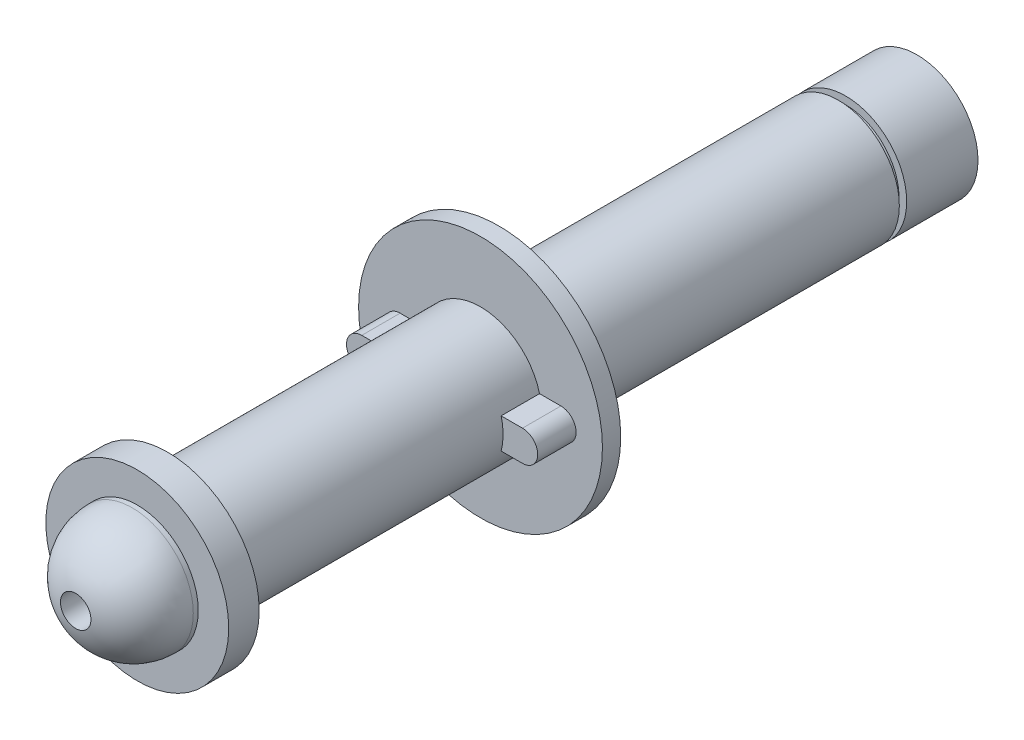
ISO-10303-21;
HEADER;
FILE_DESCRIPTION(('STEP AP214'),'2;1');
FILE_NAME('part.step','',(''),(''),'','','');
FILE_SCHEMA(('AUTOMOTIVE_DESIGN { 1 0 10303 214 1 1 1 1 }'));
ENDSEC;
DATA;
#1=APPLICATION_CONTEXT('core data for automotive mechanical design processes');
#2=APPLICATION_PROTOCOL_DEFINITION('international standard','automotive_design',2000,#1);
#3=PRODUCT_CONTEXT('',#1,'mechanical');
#4=PRODUCT('Part','Part','',(#3));
#5=PRODUCT_RELATED_PRODUCT_CATEGORY('part','',(#4));
#6=PRODUCT_DEFINITION_FORMATION('','',#4);
#7=PRODUCT_DEFINITION_CONTEXT('part definition',#1,'design');
#8=PRODUCT_DEFINITION('design','',#6,#7);
#9=PRODUCT_DEFINITION_SHAPE('','',#8);
#10=(LENGTH_UNIT() NAMED_UNIT(*) SI_UNIT(.MILLI.,.METRE.));
#11=(NAMED_UNIT(*) PLANE_ANGLE_UNIT() SI_UNIT($,.RADIAN.));
#12=(NAMED_UNIT(*) SI_UNIT($,.STERADIAN.) SOLID_ANGLE_UNIT());
#13=UNCERTAINTY_MEASURE_WITH_UNIT(LENGTH_MEASURE(1.E-05),#10,'distance_accuracy_value','');
#14=(GEOMETRIC_REPRESENTATION_CONTEXT(3) GLOBAL_UNCERTAINTY_ASSIGNED_CONTEXT((#13)) GLOBAL_UNIT_ASSIGNED_CONTEXT((#10,
#11,#12)) REPRESENTATION_CONTEXT('',''));
#15=CARTESIAN_POINT('',(0.,0.,0.));
#16=DIRECTION('',(0.,0.,1.));
#17=DIRECTION('',(1.,0.,0.));
#18=AXIS2_PLACEMENT_3D('',#15,#16,#17);
#19=CARTESIAN_POINT('',(0.,0.,147.236078351609));
#20=DIRECTION('',(0.,0.,-1.));
#21=DIRECTION('',(-1.,0.,0.));
#22=AXIS2_PLACEMENT_3D('',#19,#20,#21);
#23=CYLINDRICAL_SURFACE('',#22,5.);
#24=DIRECTION('',(0.,0.,-1.));
#25=VECTOR('',#24,1.);
#26=CARTESIAN_POINT('',(4.84122918275927,1.25,144.686078351609));
#27=LINE('',#26,#25);
#28=CARTESIAN_POINT('',(4.84122918275927,1.25,144.686078351609));
#29=VERTEX_POINT('',#28);
#30=CARTESIAN_POINT('',(4.84122918275927,1.25,141.536078351609));
#31=VERTEX_POINT('',#30);
#32=EDGE_CURVE('E129',#29,#31,#27,.T.);
#33=ORIENTED_EDGE('',*,*,#32,.T.);
#34=CARTESIAN_POINT('',(0.,0.,141.536078351609));
#35=DIRECTION('',(0.,0.,1.));
#36=DIRECTION('',(1.,0.,0.));
#37=AXIS2_PLACEMENT_3D('',#34,#35,#36);
#38=CIRCLE('',#37,5.);
#39=CARTESIAN_POINT('',(-4.84122918275927,1.25,141.536078351609));
#40=VERTEX_POINT('',#39);
#41=EDGE_CURVE('E111',#31,#40,#38,.T.);
#42=ORIENTED_EDGE('',*,*,#41,.T.);
#43=DIRECTION('',(0.,0.,-1.));
#44=VECTOR('',#43,1.);
#45=CARTESIAN_POINT('',(-4.84122918275927,1.25,144.686078351609));
#46=LINE('',#45,#44);
#47=CARTESIAN_POINT('',(-4.84122918275927,1.25,144.686078351609));
#48=VERTEX_POINT('',#47);
#49=EDGE_CURVE('E158',#48,#40,#46,.T.);
#50=ORIENTED_EDGE('',*,*,#49,.F.);
#51=CARTESIAN_POINT('',(0.,0.,144.686078351609));
#52=DIRECTION('',(0.,0.,-1.));
#53=DIRECTION('',(-1.,0.,0.));
#54=AXIS2_PLACEMENT_3D('',#51,#52,#53);
#55=CIRCLE('',#54,5.);
#56=CARTESIAN_POINT('',(-4.84122918275927,-1.25,144.686078351609));
#57=VERTEX_POINT('',#56);
#58=EDGE_CURVE('E143',#57,#48,#55,.T.);
#59=ORIENTED_EDGE('',*,*,#58,.F.);
#60=DIRECTION('',(0.,0.,-1.));
#61=VECTOR('',#60,1.);
#62=CARTESIAN_POINT('',(-4.84122918275927,-1.25,144.686078351609));
#63=LINE('',#62,#61);
#64=CARTESIAN_POINT('',(-4.84122918275927,-1.25,141.536078351609));
#65=VERTEX_POINT('',#64);
#66=EDGE_CURVE('E161',#57,#65,#63,.T.);
#67=ORIENTED_EDGE('',*,*,#66,.T.);
#68=CARTESIAN_POINT('',(4.84122918275927,-1.25,141.536078351609));
#69=VERTEX_POINT('',#68);
#70=EDGE_CURVE('E231',#65,#69,#38,.T.);
#71=ORIENTED_EDGE('',*,*,#70,.T.);
#72=DIRECTION('',(0.,0.,-1.));
#73=VECTOR('',#72,1.);
#74=CARTESIAN_POINT('',(4.84122918275927,-1.25,144.686078351609));
#75=LINE('',#74,#73);
#76=CARTESIAN_POINT('',(4.84122918275927,-1.25,144.686078351609));
#77=VERTEX_POINT('',#76);
#78=EDGE_CURVE('E55',#77,#69,#75,.T.);
#79=ORIENTED_EDGE('',*,*,#78,.F.);
#80=CARTESIAN_POINT('',(0.,0.,144.686078351609));
#81=DIRECTION('',(0.,0.,-1.));
#82=DIRECTION('',(1.,0.,0.));
#83=AXIS2_PLACEMENT_3D('',#80,#81,#82);
#84=CIRCLE('',#83,5.);
#85=EDGE_CURVE('E60',#29,#77,#84,.T.);
#86=ORIENTED_EDGE('',*,*,#85,.F.);
#87=EDGE_LOOP('',(#33,#42,#50,#59,#67,#71,#79,#86));
#88=FACE_BOUND('',#87,.T.);
#89=CARTESIAN_POINT('',(0.,0.,167.186078351609));
#90=DIRECTION('',(0.,0.,1.));
#91=DIRECTION('',(1.,0.,0.));
#92=AXIS2_PLACEMENT_3D('',#89,#90,#91);
#93=CIRCLE('',#92,5.);
#94=CARTESIAN_POINT('',(5.,0.,167.186078351609));
#95=VERTEX_POINT('',#94);
#96=EDGE_CURVE('E48',#95,#95,#93,.T.);
#97=ORIENTED_EDGE('',*,*,#96,.F.);
#98=EDGE_LOOP('',(#97));
#99=FACE_BOUND('',#98,.T.);
#100=ADVANCED_FACE('F39',(#88,#99),#23,.T.);
#101=CARTESIAN_POINT('',(0.,0.,139.786078351609));
#102=DIRECTION('',(0.,0.,1.));
#103=DIRECTION('',(1.,0.,0.));
#104=AXIS2_PLACEMENT_3D('',#101,#102,#103);
#105=CIRCLE('',#104,5.);
#106=CARTESIAN_POINT('',(5.,0.,139.786078351609));
#107=VERTEX_POINT('',#106);
#108=EDGE_CURVE('E171',#107,#107,#105,.T.);
#109=ORIENTED_EDGE('',*,*,#108,.T.);
#110=EDGE_LOOP('',(#109));
#111=FACE_BOUND('',#110,.T.);
#112=CARTESIAN_POINT('',(0.,0.,140.036078351609));
#113=DIRECTION('',(0.,0.,1.));
#114=DIRECTION('',(1.,0.,0.));
#115=AXIS2_PLACEMENT_3D('',#112,#113,#114);
#116=CIRCLE('',#115,5.);
#117=CARTESIAN_POINT('',(5.,0.,140.036078351609));
#118=VERTEX_POINT('',#117);
#119=EDGE_CURVE('E208',#118,#118,#116,.T.);
#120=ORIENTED_EDGE('',*,*,#119,.F.);
#121=EDGE_LOOP('',(#120));
#122=FACE_BOUND('',#121,.T.);
#123=ADVANCED_FACE('F278',(#111,#122),#23,.T.);
#124=CARTESIAN_POINT('',(0.,0.,147.236078351609));
#125=DIRECTION('',(0.,0.,-1.));
#126=DIRECTION('',(-1.,0.,0.));
#127=AXIS2_PLACEMENT_3D('',#124,#125,#126);
#128=CYLINDRICAL_SURFACE('',#127,1.25);
#129=CARTESIAN_POINT('',(0.,0.,105.736078351609));
#130=DIRECTION('',(0.,0.,1.));
#131=DIRECTION('',(1.,0.,0.));
#132=AXIS2_PLACEMENT_3D('',#129,#130,#131);
#133=CIRCLE('',#132,1.25);
#134=CARTESIAN_POINT('',(1.25,0.,105.736078351609));
#135=VERTEX_POINT('',#134);
#136=EDGE_CURVE('E189',#135,#135,#133,.T.);
#137=ORIENTED_EDGE('',*,*,#136,.F.);
#138=EDGE_LOOP('',(#137));
#139=FACE_BOUND('',#138,.T.);
#140=CARTESIAN_POINT('',(0.,0.,140.036078351609));
#141=DIRECTION('',(0.,0.,1.));
#142=DIRECTION('',(1.,0.,0.));
#143=AXIS2_PLACEMENT_3D('',#140,#141,#142);
#144=CIRCLE('',#143,1.25);
#145=CARTESIAN_POINT('',(1.25,0.,140.036078351609));
#146=VERTEX_POINT('',#145);
#147=EDGE_CURVE('E198',#146,#146,#144,.T.);
#148=ORIENTED_EDGE('',*,*,#147,.T.);
#149=EDGE_LOOP('',(#148));
#150=FACE_BOUND('',#149,.T.);
#151=ADVANCED_FACE('F282',(#139,#150),#128,.F.);
#152=CARTESIAN_POINT('',(0.,0.,112.186078351609));
#153=DIRECTION('',(0.,0.,1.));
#154=DIRECTION('',(1.,0.,0.));
#155=AXIS2_PLACEMENT_3D('',#152,#153,#154);
#156=CIRCLE('',#155,5.);
#157=CARTESIAN_POINT('',(5.,0.,112.186078351609));
#158=VERTEX_POINT('',#157);
#159=EDGE_CURVE('E183',#158,#158,#156,.T.);
#160=ORIENTED_EDGE('',*,*,#159,.T.);
#161=EDGE_LOOP('',(#160));
#162=FACE_BOUND('',#161,.T.);
#163=CARTESIAN_POINT('',(0.,0.,139.186078351609));
#164=DIRECTION('',(0.,0.,1.));
#165=DIRECTION('',(1.,0.,0.));
#166=AXIS2_PLACEMENT_3D('',#163,#164,#165);
#167=CIRCLE('',#166,5.);
#168=CARTESIAN_POINT('',(5.,0.,139.186078351609));
#169=VERTEX_POINT('',#168);
#170=EDGE_CURVE('E174',#169,#169,#167,.T.);
#171=ORIENTED_EDGE('',*,*,#170,.F.);
#172=EDGE_LOOP('',(#171));
#173=FACE_BOUND('',#172,.T.);
#174=ADVANCED_FACE('F284',(#162,#173),#23,.T.);
#175=CARTESIAN_POINT('',(0.,0.,105.736078351609));
#176=DIRECTION('',(0.,0.,1.));
#177=DIRECTION('',(1.,0.,0.));
#178=AXIS2_PLACEMENT_3D('',#175,#176,#177);
#179=CIRCLE('',#178,5.);
#180=CARTESIAN_POINT('',(5.,0.,105.736078351609));
#181=VERTEX_POINT('',#180);
#182=EDGE_CURVE('E194',#181,#181,#179,.T.);
#183=ORIENTED_EDGE('',*,*,#182,.T.);
#184=EDGE_LOOP('',(#183));
#185=FACE_BOUND('',#184,.T.);
#186=CARTESIAN_POINT('',(0.,0.,111.586078351609));
#187=DIRECTION('',(0.,0.,1.));
#188=DIRECTION('',(1.,0.,0.));
#189=AXIS2_PLACEMENT_3D('',#186,#187,#188);
#190=CIRCLE('',#189,5.);
#191=CARTESIAN_POINT('',(5.,0.,111.586078351609));
#192=VERTEX_POINT('',#191);
#193=EDGE_CURVE('E186',#192,#192,#190,.T.);
#194=ORIENTED_EDGE('',*,*,#193,.F.);
#195=EDGE_LOOP('',(#194));
#196=FACE_BOUND('',#195,.T.);
#197=ADVANCED_FACE('F269',(#185,#196),#23,.T.);
#198=CARTESIAN_POINT('',(0.,0.,105.736078351609));
#199=DIRECTION('',(0.,0.,1.));
#200=DIRECTION('',(1.,0.,0.));
#201=AXIS2_PLACEMENT_3D('',#198,#199,#200);
#202=PLANE('',#201);
#203=ORIENTED_EDGE('',*,*,#182,.F.);
#204=EDGE_LOOP('',(#203));
#205=FACE_BOUND('',#204,.T.);
#206=ORIENTED_EDGE('',*,*,#136,.T.);
#207=EDGE_LOOP('',(#206));
#208=FACE_BOUND('',#207,.T.);
#209=ADVANCED_FACE('F286',(#205,#208),#202,.F.);
#210=CARTESIAN_POINT('',(0.,0.,111.586078351609));
#211=DIRECTION('',(0.,0.,1.));
#212=DIRECTION('',(1.,0.,0.));
#213=AXIS2_PLACEMENT_3D('',#210,#211,#212);
#214=PLANE('',#213);
#215=CARTESIAN_POINT('',(0.,0.,111.586078351609));
#216=DIRECTION('',(0.,0.,1.));
#217=DIRECTION('',(1.,0.,0.));
#218=AXIS2_PLACEMENT_3D('',#215,#216,#217);
#219=CIRCLE('',#218,4.375);
#220=CARTESIAN_POINT('',(4.375,0.,111.586078351609));
#221=VERTEX_POINT('',#220);
#222=EDGE_CURVE('E180',#221,#221,#219,.T.);
#223=ORIENTED_EDGE('',*,*,#222,.F.);
#224=EDGE_LOOP('',(#223));
#225=FACE_BOUND('',#224,.T.);
#226=ORIENTED_EDGE('',*,*,#193,.T.);
#227=EDGE_LOOP('',(#226));
#228=FACE_BOUND('',#227,.T.);
#229=ADVANCED_FACE('F289',(#225,#228),#214,.T.);
#230=CARTESIAN_POINT('',(0.,0.,112.186078351609));
#231=DIRECTION('',(0.,0.,1.));
#232=DIRECTION('',(1.,0.,0.));
#233=AXIS2_PLACEMENT_3D('',#230,#231,#232);
#234=PLANE('',#233);
#235=CARTESIAN_POINT('',(0.,0.,112.186078351609));
#236=DIRECTION('',(0.,0.,1.));
#237=DIRECTION('',(1.,0.,0.));
#238=AXIS2_PLACEMENT_3D('',#235,#236,#237);
#239=CIRCLE('',#238,4.375);
#240=CARTESIAN_POINT('',(4.375,0.,112.186078351609));
#241=VERTEX_POINT('',#240);
#242=EDGE_CURVE('E177',#241,#241,#239,.T.);
#243=ORIENTED_EDGE('',*,*,#242,.T.);
#244=EDGE_LOOP('',(#243));
#245=FACE_BOUND('',#244,.T.);
#246=ORIENTED_EDGE('',*,*,#159,.F.);
#247=EDGE_LOOP('',(#246));
#248=FACE_BOUND('',#247,.T.);
#249=ADVANCED_FACE('F294',(#245,#248),#234,.F.);
#250=CARTESIAN_POINT('',(0.,0.,111.586078351609));
#251=DIRECTION('',(0.,0.,1.));
#252=DIRECTION('',(1.,0.,0.));
#253=AXIS2_PLACEMENT_3D('',#250,#251,#252);
#254=CYLINDRICAL_SURFACE('',#253,4.375);
#255=ORIENTED_EDGE('',*,*,#222,.T.);
#256=EDGE_LOOP('',(#255));
#257=FACE_BOUND('',#256,.T.);
#258=ORIENTED_EDGE('',*,*,#242,.F.);
#259=EDGE_LOOP('',(#258));
#260=FACE_BOUND('',#259,.T.);
#261=ADVANCED_FACE('F297',(#257,#260),#254,.T.);
#262=CARTESIAN_POINT('',(0.,0.,139.186078351609));
#263=DIRECTION('',(0.,0.,1.));
#264=DIRECTION('',(1.,0.,0.));
#265=AXIS2_PLACEMENT_3D('',#262,#263,#264);
#266=PLANE('',#265);
#267=CARTESIAN_POINT('',(0.,0.,139.186078351609));
#268=DIRECTION('',(0.,0.,1.));
#269=DIRECTION('',(1.,0.,0.));
#270=AXIS2_PLACEMENT_3D('',#267,#268,#269);
#271=CIRCLE('',#270,4.375);
#272=CARTESIAN_POINT('',(4.375,0.,139.186078351609));
#273=VERTEX_POINT('',#272);
#274=EDGE_CURVE('E168',#273,#273,#271,.T.);
#275=ORIENTED_EDGE('',*,*,#274,.F.);
#276=EDGE_LOOP('',(#275));
#277=FACE_BOUND('',#276,.T.);
#278=ORIENTED_EDGE('',*,*,#170,.T.);
#279=EDGE_LOOP('',(#278));
#280=FACE_BOUND('',#279,.T.);
#281=ADVANCED_FACE('F304',(#277,#280),#266,.T.);
#282=CARTESIAN_POINT('',(0.,0.,139.786078351609));
#283=DIRECTION('',(0.,0.,1.));
#284=DIRECTION('',(1.,0.,0.));
#285=AXIS2_PLACEMENT_3D('',#282,#283,#284);
#286=PLANE('',#285);
#287=CARTESIAN_POINT('',(0.,0.,139.786078351609));
#288=DIRECTION('',(0.,0.,1.));
#289=DIRECTION('',(1.,0.,0.));
#290=AXIS2_PLACEMENT_3D('',#287,#288,#289);
#291=CIRCLE('',#290,4.375);
#292=CARTESIAN_POINT('',(4.375,0.,139.786078351609));
#293=VERTEX_POINT('',#292);
#294=EDGE_CURVE('E167',#293,#293,#291,.T.);
#295=ORIENTED_EDGE('',*,*,#294,.T.);
#296=EDGE_LOOP('',(#295));
#297=FACE_BOUND('',#296,.T.);
#298=ORIENTED_EDGE('',*,*,#108,.F.);
#299=EDGE_LOOP('',(#298));
#300=FACE_BOUND('',#299,.T.);
#301=ADVANCED_FACE('F306',(#297,#300),#286,.F.);
#302=CARTESIAN_POINT('',(0.,0.,139.186078351609));
#303=DIRECTION('',(0.,0.,1.));
#304=DIRECTION('',(1.,0.,0.));
#305=AXIS2_PLACEMENT_3D('',#302,#303,#304);
#306=CYLINDRICAL_SURFACE('',#305,4.375);
#307=ORIENTED_EDGE('',*,*,#274,.T.);
#308=EDGE_LOOP('',(#307));
#309=FACE_BOUND('',#308,.T.);
#310=ORIENTED_EDGE('',*,*,#294,.F.);
#311=EDGE_LOOP('',(#310));
#312=FACE_BOUND('',#311,.T.);
#313=ADVANCED_FACE('F309',(#309,#312),#306,.T.);
#314=CARTESIAN_POINT('',(0.,0.,140.036078351609));
#315=DIRECTION('',(0.,0.,1.));
#316=DIRECTION('',(1.,0.,0.));
#317=AXIS2_PLACEMENT_3D('',#314,#315,#316);
#318=PLANE('',#317);
#319=ORIENTED_EDGE('',*,*,#119,.T.);
#320=EDGE_LOOP('',(#319));
#321=FACE_BOUND('',#320,.T.);
#322=CARTESIAN_POINT('',(0.,0.,140.036078351609));
#323=DIRECTION('',(0.,0.,1.));
#324=DIRECTION('',(1.,0.,0.));
#325=AXIS2_PLACEMENT_3D('',#322,#323,#324);
#326=CIRCLE('',#325,10.);
#327=CARTESIAN_POINT('',(10.,0.,140.036078351609));
#328=VERTEX_POINT('',#327);
#329=EDGE_CURVE('E234',#328,#328,#326,.T.);
#330=ORIENTED_EDGE('',*,*,#329,.F.);
#331=EDGE_LOOP('',(#330));
#332=FACE_BOUND('',#331,.T.);
#333=ADVANCED_FACE('F316',(#321,#332),#318,.F.);
#334=CARTESIAN_POINT('',(0.,0.,140.036078351609));
#335=DIRECTION('',(0.,0.,1.));
#336=DIRECTION('',(1.,0.,0.));
#337=AXIS2_PLACEMENT_3D('',#334,#335,#336);
#338=CYLINDRICAL_SURFACE('',#337,10.);
#339=ORIENTED_EDGE('',*,*,#329,.T.);
#340=EDGE_LOOP('',(#339));
#341=FACE_BOUND('',#340,.T.);
#342=CARTESIAN_POINT('',(0.,0.,141.536078351609));
#343=DIRECTION('',(0.,0.,1.));
#344=DIRECTION('',(1.,0.,0.));
#345=AXIS2_PLACEMENT_3D('',#342,#343,#344);
#346=CIRCLE('',#345,10.);
#347=CARTESIAN_POINT('',(10.,0.,141.536078351609));
#348=VERTEX_POINT('',#347);
#349=EDGE_CURVE('E236',#348,#348,#346,.T.);
#350=ORIENTED_EDGE('',*,*,#349,.F.);
#351=EDGE_LOOP('',(#350));
#352=FACE_BOUND('',#351,.T.);
#353=ADVANCED_FACE('F345',(#341,#352),#338,.T.);
#354=CARTESIAN_POINT('',(0.,0.,141.536078351609));
#355=DIRECTION('',(0.,0.,1.));
#356=DIRECTION('',(1.,0.,0.));
#357=AXIS2_PLACEMENT_3D('',#354,#355,#356);
#358=PLANE('',#357);
#359=ORIENTED_EDGE('',*,*,#349,.T.);
#360=EDGE_LOOP('',(#359));
#361=FACE_BOUND('',#360,.T.);
#362=DIRECTION('',(1.,0.,0.));
#363=VECTOR('',#362,1.);
#364=CARTESIAN_POINT('',(-4.84122918275927,-1.25,141.536078351609));
#365=LINE('',#364,#363);
#366=CARTESIAN_POINT('',(-6.59122918275927,-1.25,141.536078351609));
#367=VERTEX_POINT('',#366);
#368=EDGE_CURVE('E151',#367,#65,#365,.T.);
#369=ORIENTED_EDGE('',*,*,#368,.F.);
#370=CARTESIAN_POINT('',(-6.59122918275927,0.,141.536078351609));
#371=DIRECTION('',(0.,0.,1.));
#372=DIRECTION('',(1.,0.,0.));
#373=AXIS2_PLACEMENT_3D('',#370,#371,#372);
#374=CIRCLE('',#373,1.25);
#375=CARTESIAN_POINT('',(-6.59122918275927,1.25,141.536078351609));
#376=VERTEX_POINT('',#375);
#377=EDGE_CURVE('E135',#376,#367,#374,.T.);
#378=ORIENTED_EDGE('',*,*,#377,.F.);
#379=DIRECTION('',(-1.,0.,0.));
#380=VECTOR('',#379,1.);
#381=CARTESIAN_POINT('',(-4.84122918275927,1.25,141.536078351609));
#382=LINE('',#381,#380);
#383=EDGE_CURVE('E140',#40,#376,#382,.T.);
#384=ORIENTED_EDGE('',*,*,#383,.F.);
#385=ORIENTED_EDGE('',*,*,#41,.F.);
#386=DIRECTION('',(-1.,0.,0.));
#387=VECTOR('',#386,1.);
#388=CARTESIAN_POINT('',(4.84122918275927,1.25,141.536078351609));
#389=LINE('',#388,#387);
#390=CARTESIAN_POINT('',(6.59122918275927,1.25,141.536078351609));
#391=VERTEX_POINT('',#390);
#392=EDGE_CURVE('E105',#391,#31,#389,.T.);
#393=ORIENTED_EDGE('',*,*,#392,.F.);
#394=CARTESIAN_POINT('',(6.59122918275927,0.,141.536078351609));
#395=DIRECTION('',(0.,0.,1.));
#396=DIRECTION('',(-1.,0.,0.));
#397=AXIS2_PLACEMENT_3D('',#394,#395,#396);
#398=CIRCLE('',#397,1.25);
#399=CARTESIAN_POINT('',(6.59122918275927,-1.25,141.536078351609));
#400=VERTEX_POINT('',#399);
#401=EDGE_CURVE('E108',#400,#391,#398,.T.);
#402=ORIENTED_EDGE('',*,*,#401,.F.);
#403=DIRECTION('',(1.,0.,0.));
#404=VECTOR('',#403,1.);
#405=CARTESIAN_POINT('',(4.84122918275927,-1.25,141.536078351609));
#406=LINE('',#405,#404);
#407=EDGE_CURVE('E125',#69,#400,#406,.T.);
#408=ORIENTED_EDGE('',*,*,#407,.F.);
#409=ORIENTED_EDGE('',*,*,#70,.F.);
#410=EDGE_LOOP('',(#369,#378,#384,#385,#393,#402,#408,#409));
#411=FACE_BOUND('',#410,.T.);
#412=ADVANCED_FACE('F107',(#361,#411),#358,.T.);
#413=ORIENTED_EDGE('',*,*,#147,.F.);
#414=EDGE_LOOP('',(#413));
#415=FACE_BOUND('',#414,.T.);
#416=ADVANCED_FACE('F334',(#415),#318,.F.);
#417=CARTESIAN_POINT('',(-6.59122918275927,0.,144.686078351609));
#418=DIRECTION('',(0.,0.,1.));
#419=DIRECTION('',(1.,0.,0.));
#420=AXIS2_PLACEMENT_3D('',#417,#418,#419);
#421=PLANE('',#420);
#422=CARTESIAN_POINT('',(-6.59122918275927,0.,144.686078351609));
#423=DIRECTION('',(0.,0.,1.));
#424=DIRECTION('',(1.,0.,0.));
#425=AXIS2_PLACEMENT_3D('',#422,#423,#424);
#426=CIRCLE('',#425,1.25);
#427=CARTESIAN_POINT('',(-6.59122918275927,1.25,144.686078351609));
#428=VERTEX_POINT('',#427);
#429=CARTESIAN_POINT('',(-6.59122918275927,-1.25,144.686078351609));
#430=VERTEX_POINT('',#429);
#431=EDGE_CURVE('E136',#428,#430,#426,.T.);
#432=ORIENTED_EDGE('',*,*,#431,.T.);
#433=DIRECTION('',(1.,0.,0.));
#434=VECTOR('',#433,1.);
#435=CARTESIAN_POINT('',(-4.84122918275927,-1.25,144.686078351609));
#436=LINE('',#435,#434);
#437=EDGE_CURVE('E139',#430,#57,#436,.T.);
#438=ORIENTED_EDGE('',*,*,#437,.T.);
#439=ORIENTED_EDGE('',*,*,#58,.T.);
#440=DIRECTION('',(-1.,0.,0.));
#441=VECTOR('',#440,1.);
#442=CARTESIAN_POINT('',(-4.84122918275927,1.25,144.686078351609));
#443=LINE('',#442,#441);
#444=EDGE_CURVE('E146',#48,#428,#443,.T.);
#445=ORIENTED_EDGE('',*,*,#444,.T.);
#446=EDGE_LOOP('',(#432,#438,#439,#445));
#447=FACE_BOUND('',#446,.T.);
#448=ADVANCED_FACE('F331',(#447),#421,.T.);
#449=CARTESIAN_POINT('',(0.,0.,144.686078351609));
#450=DIRECTION('',(0.,0.,1.));
#451=DIRECTION('',(1.,0.,0.));
#452=AXIS2_PLACEMENT_3D('',#449,#450,#451);
#453=PLANE('',#452);
#454=ORIENTED_EDGE('',*,*,#85,.T.);
#455=DIRECTION('',(1.,0.,0.));
#456=VECTOR('',#455,1.);
#457=CARTESIAN_POINT('',(4.84122918275927,-1.25,144.686078351609));
#458=LINE('',#457,#456);
#459=CARTESIAN_POINT('',(6.59122918275927,-1.25,144.686078351609));
#460=VERTEX_POINT('',#459);
#461=EDGE_CURVE('E224',#77,#460,#458,.T.);
#462=ORIENTED_EDGE('',*,*,#461,.T.);
#463=CARTESIAN_POINT('',(6.59122918275927,0.,144.686078351609));
#464=DIRECTION('',(0.,0.,1.));
#465=DIRECTION('',(-1.,0.,0.));
#466=AXIS2_PLACEMENT_3D('',#463,#464,#465);
#467=CIRCLE('',#466,1.25);
#468=CARTESIAN_POINT('',(6.59122918275927,1.25,144.686078351609));
#469=VERTEX_POINT('',#468);
#470=EDGE_CURVE('E226',#460,#469,#467,.T.);
#471=ORIENTED_EDGE('',*,*,#470,.T.);
#472=DIRECTION('',(-1.,0.,0.));
#473=VECTOR('',#472,1.);
#474=CARTESIAN_POINT('',(4.84122918275927,1.25,144.686078351609));
#475=LINE('',#474,#473);
#476=EDGE_CURVE('E128',#469,#29,#475,.T.);
#477=ORIENTED_EDGE('',*,*,#476,.T.);
#478=EDGE_LOOP('',(#454,#462,#471,#477));
#479=FACE_BOUND('',#478,.T.);
#480=ADVANCED_FACE('F329',(#479),#453,.T.);
#481=CARTESIAN_POINT('',(-4.84122918275927,1.25,144.686078351609));
#482=DIRECTION('',(0.,-1.,0.));
#483=DIRECTION('',(1.,0.,0.));
#484=AXIS2_PLACEMENT_3D('',#481,#482,#483);
#485=PLANE('',#484);
#486=ORIENTED_EDGE('',*,*,#383,.T.);
#487=DIRECTION('',(0.,0.,-1.));
#488=VECTOR('',#487,1.);
#489=CARTESIAN_POINT('',(-6.59122918275927,1.25,144.686078351609));
#490=LINE('',#489,#488);
#491=EDGE_CURVE('E148',#428,#376,#490,.T.);
#492=ORIENTED_EDGE('',*,*,#491,.F.);
#493=ORIENTED_EDGE('',*,*,#444,.F.);
#494=ORIENTED_EDGE('',*,*,#49,.T.);
#495=EDGE_LOOP('',(#486,#492,#493,#494));
#496=FACE_BOUND('',#495,.T.);
#497=ADVANCED_FACE('F325',(#496),#485,.F.);
#498=CARTESIAN_POINT('',(-4.84122918275927,-1.25,144.686078351609));
#499=DIRECTION('',(0.,1.,0.));
#500=DIRECTION('',(-1.,0.,0.));
#501=AXIS2_PLACEMENT_3D('',#498,#499,#500);
#502=PLANE('',#501);
#503=ORIENTED_EDGE('',*,*,#368,.T.);
#504=ORIENTED_EDGE('',*,*,#66,.F.);
#505=ORIENTED_EDGE('',*,*,#437,.F.);
#506=DIRECTION('',(0.,0.,-1.));
#507=VECTOR('',#506,1.);
#508=CARTESIAN_POINT('',(-6.59122918275927,-1.25,144.686078351609));
#509=LINE('',#508,#507);
#510=EDGE_CURVE('E164',#430,#367,#509,.T.);
#511=ORIENTED_EDGE('',*,*,#510,.T.);
#512=EDGE_LOOP('',(#503,#504,#505,#511));
#513=FACE_BOUND('',#512,.T.);
#514=ADVANCED_FACE('F321',(#513),#502,.F.);
#515=CARTESIAN_POINT('',(-6.59122918275927,0.,144.686078351609));
#516=DIRECTION('',(0.,0.,-1.));
#517=DIRECTION('',(-1.,0.,0.));
#518=AXIS2_PLACEMENT_3D('',#515,#516,#517);
#519=CYLINDRICAL_SURFACE('',#518,1.25);
#520=ORIENTED_EDGE('',*,*,#377,.T.);
#521=ORIENTED_EDGE('',*,*,#510,.F.);
#522=ORIENTED_EDGE('',*,*,#431,.F.);
#523=ORIENTED_EDGE('',*,*,#491,.T.);
#524=EDGE_LOOP('',(#520,#521,#522,#523));
#525=FACE_BOUND('',#524,.T.);
#526=ADVANCED_FACE('F318',(#525),#519,.T.);
#527=CARTESIAN_POINT('',(4.84122918275927,1.25,144.686078351609));
#528=DIRECTION('',(0.,-1.,0.));
#529=DIRECTION('',(1.,0.,0.));
#530=AXIS2_PLACEMENT_3D('',#527,#528,#529);
#531=PLANE('',#530);
#532=ORIENTED_EDGE('',*,*,#392,.T.);
#533=ORIENTED_EDGE('',*,*,#32,.F.);
#534=ORIENTED_EDGE('',*,*,#476,.F.);
#535=DIRECTION('',(0.,0.,-1.));
#536=VECTOR('',#535,1.);
#537=CARTESIAN_POINT('',(6.59122918275927,1.25,144.686078351609));
#538=LINE('',#537,#536);
#539=EDGE_CURVE('E121',#469,#391,#538,.T.);
#540=ORIENTED_EDGE('',*,*,#539,.T.);
#541=EDGE_LOOP('',(#532,#533,#534,#540));
#542=FACE_BOUND('',#541,.T.);
#543=ADVANCED_FACE('F127',(#542),#531,.F.);
#544=CARTESIAN_POINT('',(6.59122918275927,0.,144.686078351609));
#545=DIRECTION('',(0.,0.,-1.));
#546=DIRECTION('',(-1.,0.,0.));
#547=AXIS2_PLACEMENT_3D('',#544,#545,#546);
#548=CYLINDRICAL_SURFACE('',#547,1.25);
#549=ORIENTED_EDGE('',*,*,#401,.T.);
#550=ORIENTED_EDGE('',*,*,#539,.F.);
#551=ORIENTED_EDGE('',*,*,#470,.F.);
#552=DIRECTION('',(0.,0.,-1.));
#553=VECTOR('',#552,1.);
#554=CARTESIAN_POINT('',(6.59122918275927,-1.25,144.686078351609));
#555=LINE('',#554,#553);
#556=EDGE_CURVE('E124',#460,#400,#555,.T.);
#557=ORIENTED_EDGE('',*,*,#556,.T.);
#558=EDGE_LOOP('',(#549,#550,#551,#557));
#559=FACE_BOUND('',#558,.T.);
#560=ADVANCED_FACE('F119',(#559),#548,.T.);
#561=CARTESIAN_POINT('',(4.84122918275927,-1.25,144.686078351609));
#562=DIRECTION('',(0.,1.,0.));
#563=DIRECTION('',(-1.,0.,0.));
#564=AXIS2_PLACEMENT_3D('',#561,#562,#563);
#565=PLANE('',#564);
#566=ORIENTED_EDGE('',*,*,#407,.T.);
#567=ORIENTED_EDGE('',*,*,#556,.F.);
#568=ORIENTED_EDGE('',*,*,#461,.F.);
#569=ORIENTED_EDGE('',*,*,#78,.T.);
#570=EDGE_LOOP('',(#566,#567,#568,#569));
#571=FACE_BOUND('',#570,.T.);
#572=ADVANCED_FACE('F230',(#571),#565,.F.);
#573=CARTESIAN_POINT('',(0.,0.,169.686078351609));
#574=DIRECTION('',(0.,0.,-1.));
#575=DIRECTION('',(-1.,0.,0.));
#576=AXIS2_PLACEMENT_3D('',#573,#574,#575);
#577=CYLINDRICAL_SURFACE('',#576,7.5);
#578=CARTESIAN_POINT('',(0.,0.,169.686078351609));
#579=DIRECTION('',(0.,0.,1.));
#580=DIRECTION('',(1.,0.,0.));
#581=AXIS2_PLACEMENT_3D('',#578,#579,#580);
#582=CIRCLE('',#581,7.5);
#583=CARTESIAN_POINT('',(7.5,0.,169.686078351609));
#584=VERTEX_POINT('',#583);
#585=EDGE_CURVE('E205',#584,#584,#582,.T.);
#586=ORIENTED_EDGE('',*,*,#585,.F.);
#587=EDGE_LOOP('',(#586));
#588=FACE_BOUND('',#587,.T.);
#589=CARTESIAN_POINT('',(0.,0.,167.186078351609));
#590=DIRECTION('',(0.,0.,1.));
#591=DIRECTION('',(1.,0.,0.));
#592=AXIS2_PLACEMENT_3D('',#589,#590,#591);
#593=CIRCLE('',#592,7.5);
#594=CARTESIAN_POINT('',(7.5,0.,167.186078351609));
#595=VERTEX_POINT('',#594);
#596=EDGE_CURVE('E243',#595,#595,#593,.T.);
#597=ORIENTED_EDGE('',*,*,#596,.T.);
#598=EDGE_LOOP('',(#597));
#599=FACE_BOUND('',#598,.T.);
#600=ADVANCED_FACE('F251',(#588,#599),#577,.T.);
#601=CARTESIAN_POINT('',(0.,0.,169.686078351609));
#602=DIRECTION('',(0.,0.,1.));
#603=DIRECTION('',(1.,0.,0.));
#604=AXIS2_PLACEMENT_3D('',#601,#602,#603);
#605=PLANE('',#604);
#606=CARTESIAN_POINT('',(0.,0.,169.686078351609));
#607=DIRECTION('',(0.,0.,1.));
#608=DIRECTION('',(1.,0.,0.));
#609=AXIS2_PLACEMENT_3D('',#606,#607,#608);
#610=CIRCLE('',#609,5.);
#611=CARTESIAN_POINT('',(5.,0.,169.686078351609));
#612=VERTEX_POINT('',#611);
#613=EDGE_CURVE('E204',#612,#612,#610,.T.);
#614=ORIENTED_EDGE('',*,*,#613,.F.);
#615=EDGE_LOOP('',(#614));
#616=FACE_BOUND('',#615,.T.);
#617=ORIENTED_EDGE('',*,*,#585,.T.);
#618=EDGE_LOOP('',(#617));
#619=FACE_BOUND('',#618,.T.);
#620=ADVANCED_FACE('F249',(#616,#619),#605,.T.);
#621=CARTESIAN_POINT('',(0.,0.,167.186078351609));
#622=DIRECTION('',(0.,0.,1.));
#623=DIRECTION('',(1.,0.,0.));
#624=AXIS2_PLACEMENT_3D('',#621,#622,#623);
#625=PLANE('',#624);
#626=ORIENTED_EDGE('',*,*,#96,.T.);
#627=EDGE_LOOP('',(#626));
#628=FACE_BOUND('',#627,.T.);
#629=ORIENTED_EDGE('',*,*,#596,.F.);
#630=EDGE_LOOP('',(#629));
#631=FACE_BOUND('',#630,.T.);
#632=ADVANCED_FACE('F257',(#628,#631),#625,.F.);
#633=CARTESIAN_POINT('',(0.,0.,170.092534446358));
#634=DIRECTION('',(0.,0.,1.));
#635=DIRECTION('',(1.,0.,0.));
#636=AXIS2_PLACEMENT_3D('',#633,#634,#635);
#637=CIRCLE('',#636,5.);
#638=CARTESIAN_POINT('',(5.,0.,170.092534446358));
#639=VERTEX_POINT('',#638);
#640=EDGE_CURVE('E11',#639,#639,#637,.F.);
#641=ORIENTED_EDGE('',*,*,#640,.T.);
#642=EDGE_LOOP('',(#641));
#643=FACE_BOUND('',#642,.T.);
#644=ORIENTED_EDGE('',*,*,#613,.T.);
#645=EDGE_LOOP('',(#644));
#646=FACE_BOUND('',#645,.T.);
#647=ADVANCED_FACE('F259',(#643,#646),#23,.T.);
#648=CARTESIAN_POINT('',(0.,0.,169.686078351609));
#649=DIRECTION('',(0.,0.,1.));
#650=DIRECTION('',(1.,0.,0.));
#651=AXIS2_PLACEMENT_3D('',#648,#649,#650);
#652=CIRCLE('',#651,1.25);
#653=CARTESIAN_POINT('',(1.25,0.,169.686078351609));
#654=VERTEX_POINT('',#653);
#655=EDGE_CURVE('E206',#654,#654,#652,.T.);
#656=ORIENTED_EDGE('',*,*,#655,.F.);
#657=EDGE_LOOP('',(#656));
#658=FACE_BOUND('',#657,.T.);
#659=CARTESIAN_POINT('',(0.,0.,174.736078351609));
#660=DIRECTION('',(0.,0.,1.));
#661=DIRECTION('',(1.,0.,0.));
#662=AXIS2_PLACEMENT_3D('',#659,#660,#661);
#663=CIRCLE('',#662,1.25);
#664=CARTESIAN_POINT('',(1.25,0.,174.736078351609));
#665=VERTEX_POINT('',#664);
#666=EDGE_CURVE('E201',#665,#665,#663,.F.);
#667=ORIENTED_EDGE('',*,*,#666,.F.);
#668=EDGE_LOOP('',(#667));
#669=FACE_BOUND('',#668,.T.);
#670=ADVANCED_FACE('F267',(#658,#669),#128,.F.);
#671=ORIENTED_EDGE('',*,*,#655,.T.);
#672=EDGE_LOOP('',(#671));
#673=FACE_BOUND('',#672,.T.);
#674=ADVANCED_FACE('F272',(#673),#605,.T.);
#675=CARTESIAN_POINT('',(0.,0.,170.092534446358));
#676=DIRECTION('',(0.,0.,1.));
#677=DIRECTION('',(1.,0.,0.));
#678=AXIS2_PLACEMENT_3D('',#675,#676,#677);
#679=DEGENERATE_TOROIDAL_SURFACE('',#678,0.25,4.75,.T.);
#680=ORIENTED_EDGE('',*,*,#640,.F.);
#681=EDGE_LOOP('',(#680));
#682=FACE_BOUND('',#681,.T.);
#683=ORIENTED_EDGE('',*,*,#666,.T.);
#684=EDGE_LOOP('',(#683));
#685=FACE_BOUND('',#684,.T.);
#686=ADVANCED_FACE('F41',(#682,#685),#679,.T.);
#687=CLOSED_SHELL('',(#100,#123,#151,#174,#197,#209,#229,#249,#261,#281,#301,#313,#333,#353,
#412,#416,#448,#480,#497,#514,#526,#543,#560,#572,#600,#620,#632,#647,#670,#674,#686));
#688=CARTESIAN_POINT('',(0.,0.,141.536078351609));
#689=DIRECTION('',(0.,0.,1.));
#690=DIRECTION('',(1.,0.,0.));
#691=AXIS2_PLACEMENT_3D('',#688,#689,#690);
#692=CIRCLE('',#691,1.25);
#693=CARTESIAN_POINT('',(1.25,0.,141.536078351609));
#694=VERTEX_POINT('',#693);
#695=EDGE_CURVE('E197',#694,#694,#692,.T.);
#696=ORIENTED_EDGE('',*,*,#695,.T.);
#697=EDGE_LOOP('',(#696));
#698=FACE_BOUND('',#697,.T.);
#699=ADVANCED_FACE('F349',(#698),#358,.T.);
#700=ORIENTED_EDGE('',*,*,#695,.F.);
#701=EDGE_LOOP('',(#700));
#702=FACE_BOUND('',#701,.T.);
#703=CARTESIAN_POINT('',(0.,0.,167.186078351609));
#704=DIRECTION('',(0.,0.,1.));
#705=DIRECTION('',(1.,0.,0.));
#706=AXIS2_PLACEMENT_3D('',#703,#704,#705);
#707=CIRCLE('',#706,1.25);
#708=CARTESIAN_POINT('',(1.25,0.,167.186078351609));
#709=VERTEX_POINT('',#708);
#710=EDGE_CURVE('E202',#709,#709,#707,.T.);
#711=ORIENTED_EDGE('',*,*,#710,.T.);
#712=EDGE_LOOP('',(#711));
#713=FACE_BOUND('',#712,.T.);
#714=ADVANCED_FACE('F274',(#702,#713),#128,.F.);
#715=ORIENTED_EDGE('',*,*,#710,.F.);
#716=EDGE_LOOP('',(#715));
#717=FACE_BOUND('',#716,.T.);
#718=ADVANCED_FACE('F262',(#717),#625,.F.);
#719=CLOSED_SHELL('',(#699,#714,#718));
#720=ORIENTED_CLOSED_SHELL('',*,#719,.T.);
#721=BREP_WITH_VOIDS('B2',#687,(#720));
#722=ADVANCED_BREP_SHAPE_REPRESENTATION('',(#18,#721),#14);
#723=SHAPE_DEFINITION_REPRESENTATION(#9,#722);
ENDSEC;
END-ISO-10303-21;
